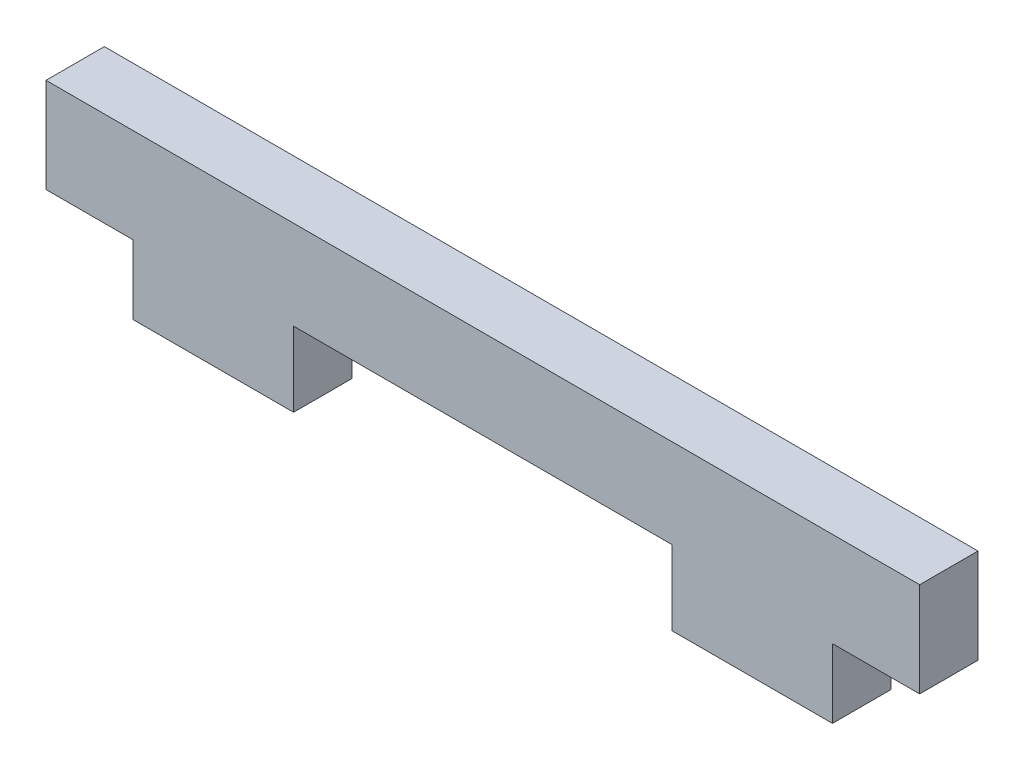
ISO-10303-21;
HEADER;
FILE_DESCRIPTION(('STEP AP214'),'2;1');
FILE_NAME('part.step','',(''),(''),'','','');
FILE_SCHEMA(('AUTOMOTIVE_DESIGN { 1 0 10303 214 1 1 1 1 }'));
ENDSEC;
DATA;
#1=APPLICATION_CONTEXT('core data for automotive mechanical design processes');
#2=APPLICATION_PROTOCOL_DEFINITION('international standard','automotive_design',2000,#1);
#3=PRODUCT_CONTEXT('',#1,'mechanical');
#4=PRODUCT('Part','Part','',(#3));
#5=PRODUCT_RELATED_PRODUCT_CATEGORY('part','',(#4));
#6=PRODUCT_DEFINITION_FORMATION('','',#4);
#7=PRODUCT_DEFINITION_CONTEXT('part definition',#1,'design');
#8=PRODUCT_DEFINITION('design','',#6,#7);
#9=PRODUCT_DEFINITION_SHAPE('','',#8);
#10=(LENGTH_UNIT() NAMED_UNIT(*) SI_UNIT(.MILLI.,.METRE.));
#11=(NAMED_UNIT(*) PLANE_ANGLE_UNIT() SI_UNIT($,.RADIAN.));
#12=(NAMED_UNIT(*) SI_UNIT($,.STERADIAN.) SOLID_ANGLE_UNIT());
#13=UNCERTAINTY_MEASURE_WITH_UNIT(LENGTH_MEASURE(1.E-05),#10,'distance_accuracy_value','');
#14=(GEOMETRIC_REPRESENTATION_CONTEXT(3) GLOBAL_UNCERTAINTY_ASSIGNED_CONTEXT((#13)) GLOBAL_UNIT_ASSIGNED_CONTEXT((#10,
#11,#12)) REPRESENTATION_CONTEXT('',''));
#15=CARTESIAN_POINT('',(0.,0.,0.));
#16=DIRECTION('',(0.,0.,1.));
#17=DIRECTION('',(1.,0.,0.));
#18=AXIS2_PLACEMENT_3D('',#15,#16,#17);
#19=CARTESIAN_POINT('',(-21.693712592762,-6.,3.7));
#20=DIRECTION('',(1.,0.,0.));
#21=DIRECTION('',(0.,1.,0.));
#22=AXIS2_PLACEMENT_3D('',#19,#20,#21);
#23=PLANE('',#22);
#24=DIRECTION('',(0.,-1.,0.));
#25=VECTOR('',#24,1.);
#26=CARTESIAN_POINT('',(-21.693712592762,-6.,0.));
#27=LINE('',#26,#25);
#28=CARTESIAN_POINT('',(-21.693712592762,0.,0.));
#29=VERTEX_POINT('',#28);
#30=CARTESIAN_POINT('',(-21.693712592762,-6.,0.));
#31=VERTEX_POINT('',#30);
#32=EDGE_CURVE('E153',#29,#31,#27,.T.);
#33=ORIENTED_EDGE('',*,*,#32,.T.);
#34=DIRECTION('',(0.,0.,-1.));
#35=VECTOR('',#34,1.);
#36=CARTESIAN_POINT('',(-21.693712592762,-6.,3.7));
#37=LINE('',#36,#35);
#38=CARTESIAN_POINT('',(-21.693712592762,-6.,3.7));
#39=VERTEX_POINT('',#38);
#40=EDGE_CURVE('E11',#39,#31,#37,.T.);
#41=ORIENTED_EDGE('',*,*,#40,.F.);
#42=DIRECTION('',(0.,-1.,0.));
#43=VECTOR('',#42,1.);
#44=CARTESIAN_POINT('',(-21.693712592762,-6.,3.7));
#45=LINE('',#44,#43);
#46=CARTESIAN_POINT('',(-21.693712592762,0.,3.7));
#47=VERTEX_POINT('',#46);
#48=EDGE_CURVE('E175',#47,#39,#45,.T.);
#49=ORIENTED_EDGE('',*,*,#48,.F.);
#50=DIRECTION('',(0.,0.,-1.));
#51=VECTOR('',#50,1.);
#52=CARTESIAN_POINT('',(-21.693712592762,0.,3.7));
#53=LINE('',#52,#51);
#54=EDGE_CURVE('E149',#47,#29,#53,.T.);
#55=ORIENTED_EDGE('',*,*,#54,.T.);
#56=EDGE_LOOP('',(#33,#41,#49,#55));
#57=FACE_BOUND('',#56,.T.);
#58=ADVANCED_FACE('F33',(#57),#23,.F.);
#59=CARTESIAN_POINT('',(-16.163712592762,-6.,3.7));
#60=DIRECTION('',(0.,1.,0.));
#61=DIRECTION('',(0.,0.,1.));
#62=AXIS2_PLACEMENT_3D('',#59,#60,#61);
#63=PLANE('',#62);
#64=DIRECTION('',(1.,0.,0.));
#65=VECTOR('',#64,1.);
#66=CARTESIAN_POINT('',(-16.163712592762,-6.,0.));
#67=LINE('',#66,#65);
#68=CARTESIAN_POINT('',(-16.163712592762,-6.,0.));
#69=VERTEX_POINT('',#68);
#70=EDGE_CURVE('E156',#31,#69,#67,.T.);
#71=ORIENTED_EDGE('',*,*,#70,.T.);
#72=DIRECTION('',(0.,0.,-1.));
#73=VECTOR('',#72,1.);
#74=CARTESIAN_POINT('',(-16.163712592762,-6.,3.7));
#75=LINE('',#74,#73);
#76=CARTESIAN_POINT('',(-16.163712592762,-6.,3.7));
#77=VERTEX_POINT('',#76);
#78=EDGE_CURVE('E41',#77,#69,#75,.T.);
#79=ORIENTED_EDGE('',*,*,#78,.F.);
#80=DIRECTION('',(1.,0.,0.));
#81=VECTOR('',#80,1.);
#82=CARTESIAN_POINT('',(-16.163712592762,-6.,3.7));
#83=LINE('',#82,#81);
#84=EDGE_CURVE('E104',#39,#77,#83,.T.);
#85=ORIENTED_EDGE('',*,*,#84,.F.);
#86=ORIENTED_EDGE('',*,*,#40,.T.);
#87=EDGE_LOOP('',(#71,#79,#85,#86));
#88=FACE_BOUND('',#87,.T.);
#89=ADVANCED_FACE('F253',(#88),#63,.F.);
#90=CARTESIAN_POINT('',(-16.163712592762,-10.3818056675996,3.7));
#91=DIRECTION('',(1.,0.,0.));
#92=DIRECTION('',(0.,0.,-1.));
#93=AXIS2_PLACEMENT_3D('',#90,#91,#92);
#94=PLANE('',#93);
#95=DIRECTION('',(0.,-1.,0.));
#96=VECTOR('',#95,1.);
#97=CARTESIAN_POINT('',(-16.163712592762,-10.3818056675996,0.));
#98=LINE('',#97,#96);
#99=CARTESIAN_POINT('',(-16.163712592762,-10.3818056675996,0.));
#100=VERTEX_POINT('',#99);
#101=EDGE_CURVE('E158',#69,#100,#98,.T.);
#102=ORIENTED_EDGE('',*,*,#101,.T.);
#103=DIRECTION('',(0.,0.,-1.));
#104=VECTOR('',#103,1.);
#105=CARTESIAN_POINT('',(-16.163712592762,-10.3818056675996,3.7));
#106=LINE('',#105,#104);
#107=CARTESIAN_POINT('',(-16.163712592762,-10.3818056675996,3.7));
#108=VERTEX_POINT('',#107);
#109=EDGE_CURVE('E194',#108,#100,#106,.T.);
#110=ORIENTED_EDGE('',*,*,#109,.F.);
#111=DIRECTION('',(0.,-1.,0.));
#112=VECTOR('',#111,1.);
#113=CARTESIAN_POINT('',(-16.163712592762,-10.3818056675996,3.7));
#114=LINE('',#113,#112);
#115=EDGE_CURVE('E202',#77,#108,#114,.T.);
#116=ORIENTED_EDGE('',*,*,#115,.F.);
#117=ORIENTED_EDGE('',*,*,#78,.T.);
#118=EDGE_LOOP('',(#102,#110,#116,#117));
#119=FACE_BOUND('',#118,.T.);
#120=ADVANCED_FACE('F200',(#119),#94,.F.);
#121=CARTESIAN_POINT('',(-5.99371259276197,-10.3818056675996,3.7));
#122=DIRECTION('',(0.,1.,0.));
#123=DIRECTION('',(0.,0.,1.));
#124=AXIS2_PLACEMENT_3D('',#121,#122,#123);
#125=PLANE('',#124);
#126=DIRECTION('',(1.,0.,0.));
#127=VECTOR('',#126,1.);
#128=CARTESIAN_POINT('',(-5.99371259276197,-10.3818056675996,0.));
#129=LINE('',#128,#127);
#130=CARTESIAN_POINT('',(-5.99371259276197,-10.3818056675996,0.));
#131=VERTEX_POINT('',#130);
#132=EDGE_CURVE('E160',#100,#131,#129,.T.);
#133=ORIENTED_EDGE('',*,*,#132,.T.);
#134=DIRECTION('',(0.,0.,-1.));
#135=VECTOR('',#134,1.);
#136=CARTESIAN_POINT('',(-5.99371259276197,-10.3818056675996,3.7));
#137=LINE('',#136,#135);
#138=CARTESIAN_POINT('',(-5.99371259276197,-10.3818056675996,3.7));
#139=VERTEX_POINT('',#138);
#140=EDGE_CURVE('E191',#139,#131,#137,.T.);
#141=ORIENTED_EDGE('',*,*,#140,.F.);
#142=DIRECTION('',(1.,0.,0.));
#143=VECTOR('',#142,1.);
#144=CARTESIAN_POINT('',(-5.99371259276197,-10.3818056675996,3.7));
#145=LINE('',#144,#143);
#146=EDGE_CURVE('E220',#108,#139,#145,.T.);
#147=ORIENTED_EDGE('',*,*,#146,.F.);
#148=ORIENTED_EDGE('',*,*,#109,.T.);
#149=EDGE_LOOP('',(#133,#141,#147,#148));
#150=FACE_BOUND('',#149,.T.);
#151=ADVANCED_FACE('F211',(#150),#125,.F.);
#152=CARTESIAN_POINT('',(-5.99371259276197,-5.65013306973486,3.7));
#153=DIRECTION('',(-1.,0.,0.));
#154=DIRECTION('',(0.,0.,1.));
#155=AXIS2_PLACEMENT_3D('',#152,#153,#154);
#156=PLANE('',#155);
#157=DIRECTION('',(0.,1.,0.));
#158=VECTOR('',#157,1.);
#159=CARTESIAN_POINT('',(-5.99371259276197,-5.65013306973486,0.));
#160=LINE('',#159,#158);
#161=CARTESIAN_POINT('',(-5.99371259276197,-5.65013306973486,0.));
#162=VERTEX_POINT('',#161);
#163=EDGE_CURVE('E162',#131,#162,#160,.T.);
#164=ORIENTED_EDGE('',*,*,#163,.T.);
#165=DIRECTION('',(0.,0.,-1.));
#166=VECTOR('',#165,1.);
#167=CARTESIAN_POINT('',(-5.99371259276197,-5.65013306973486,3.7));
#168=LINE('',#167,#166);
#169=CARTESIAN_POINT('',(-5.99371259276197,-5.65013306973486,3.7));
#170=VERTEX_POINT('',#169);
#171=EDGE_CURVE('E188',#170,#162,#168,.T.);
#172=ORIENTED_EDGE('',*,*,#171,.F.);
#173=DIRECTION('',(0.,1.,0.));
#174=VECTOR('',#173,1.);
#175=CARTESIAN_POINT('',(-5.99371259276197,-5.65013306973486,3.7));
#176=LINE('',#175,#174);
#177=EDGE_CURVE('E217',#139,#170,#176,.T.);
#178=ORIENTED_EDGE('',*,*,#177,.F.);
#179=ORIENTED_EDGE('',*,*,#140,.T.);
#180=EDGE_LOOP('',(#164,#172,#178,#179));
#181=FACE_BOUND('',#180,.T.);
#182=ADVANCED_FACE('F215',(#181),#156,.F.);
#183=CARTESIAN_POINT('',(18.006287407238,-5.65013306973486,3.7));
#184=DIRECTION('',(0.,1.,0.));
#185=DIRECTION('',(0.,0.,1.));
#186=AXIS2_PLACEMENT_3D('',#183,#184,#185);
#187=PLANE('',#186);
#188=DIRECTION('',(1.,0.,0.));
#189=VECTOR('',#188,1.);
#190=CARTESIAN_POINT('',(18.006287407238,-5.65013306973486,0.));
#191=LINE('',#190,#189);
#192=CARTESIAN_POINT('',(18.006287407238,-5.65013306973486,0.));
#193=VERTEX_POINT('',#192);
#194=EDGE_CURVE('E164',#162,#193,#191,.T.);
#195=ORIENTED_EDGE('',*,*,#194,.T.);
#196=DIRECTION('',(0.,0.,-1.));
#197=VECTOR('',#196,1.);
#198=CARTESIAN_POINT('',(18.006287407238,-5.65013306973486,3.7));
#199=LINE('',#198,#197);
#200=CARTESIAN_POINT('',(18.006287407238,-5.65013306973486,3.7));
#201=VERTEX_POINT('',#200);
#202=EDGE_CURVE('E185',#201,#193,#199,.T.);
#203=ORIENTED_EDGE('',*,*,#202,.F.);
#204=DIRECTION('',(1.,0.,0.));
#205=VECTOR('',#204,1.);
#206=CARTESIAN_POINT('',(18.006287407238,-5.65013306973486,3.7));
#207=LINE('',#206,#205);
#208=EDGE_CURVE('E219',#170,#201,#207,.T.);
#209=ORIENTED_EDGE('',*,*,#208,.F.);
#210=ORIENTED_EDGE('',*,*,#171,.T.);
#211=EDGE_LOOP('',(#195,#203,#209,#210));
#212=FACE_BOUND('',#211,.T.);
#213=ADVANCED_FACE('F266',(#212),#187,.F.);
#214=CARTESIAN_POINT('',(18.006287407238,-10.3818056675996,3.7));
#215=DIRECTION('',(1.,0.,0.));
#216=DIRECTION('',(0.,0.,-1.));
#217=AXIS2_PLACEMENT_3D('',#214,#215,#216);
#218=PLANE('',#217);
#219=DIRECTION('',(0.,-1.,0.));
#220=VECTOR('',#219,1.);
#221=CARTESIAN_POINT('',(18.006287407238,-10.3818056675996,0.));
#222=LINE('',#221,#220);
#223=CARTESIAN_POINT('',(18.006287407238,-10.3818056675996,0.));
#224=VERTEX_POINT('',#223);
#225=EDGE_CURVE('E166',#193,#224,#222,.T.);
#226=ORIENTED_EDGE('',*,*,#225,.T.);
#227=DIRECTION('',(0.,0.,-1.));
#228=VECTOR('',#227,1.);
#229=CARTESIAN_POINT('',(18.006287407238,-10.3818056675996,3.7));
#230=LINE('',#229,#228);
#231=CARTESIAN_POINT('',(18.006287407238,-10.3818056675996,3.7));
#232=VERTEX_POINT('',#231);
#233=EDGE_CURVE('E182',#232,#224,#230,.T.);
#234=ORIENTED_EDGE('',*,*,#233,.F.);
#235=DIRECTION('',(0.,-1.,0.));
#236=VECTOR('',#235,1.);
#237=CARTESIAN_POINT('',(18.006287407238,-10.3818056675996,3.7));
#238=LINE('',#237,#236);
#239=EDGE_CURVE('E222',#201,#232,#238,.T.);
#240=ORIENTED_EDGE('',*,*,#239,.F.);
#241=ORIENTED_EDGE('',*,*,#202,.T.);
#242=EDGE_LOOP('',(#226,#234,#240,#241));
#243=FACE_BOUND('',#242,.T.);
#244=ADVANCED_FACE('F269',(#243),#218,.F.);
#245=CARTESIAN_POINT('',(28.176287407238,-10.3818056675996,3.7));
#246=DIRECTION('',(0.,1.,0.));
#247=DIRECTION('',(0.,0.,1.));
#248=AXIS2_PLACEMENT_3D('',#245,#246,#247);
#249=PLANE('',#248);
#250=DIRECTION('',(1.,0.,0.));
#251=VECTOR('',#250,1.);
#252=CARTESIAN_POINT('',(28.176287407238,-10.3818056675996,0.));
#253=LINE('',#252,#251);
#254=CARTESIAN_POINT('',(28.176287407238,-10.3818056675996,0.));
#255=VERTEX_POINT('',#254);
#256=EDGE_CURVE('E168',#224,#255,#253,.T.);
#257=ORIENTED_EDGE('',*,*,#256,.T.);
#258=DIRECTION('',(0.,0.,-1.));
#259=VECTOR('',#258,1.);
#260=CARTESIAN_POINT('',(28.176287407238,-10.3818056675996,3.7));
#261=LINE('',#260,#259);
#262=CARTESIAN_POINT('',(28.176287407238,-10.3818056675996,3.7));
#263=VERTEX_POINT('',#262);
#264=EDGE_CURVE('E179',#263,#255,#261,.T.);
#265=ORIENTED_EDGE('',*,*,#264,.F.);
#266=DIRECTION('',(1.,0.,0.));
#267=VECTOR('',#266,1.);
#268=CARTESIAN_POINT('',(28.176287407238,-10.3818056675996,3.7));
#269=LINE('',#268,#267);
#270=EDGE_CURVE('E228',#232,#263,#269,.T.);
#271=ORIENTED_EDGE('',*,*,#270,.F.);
#272=ORIENTED_EDGE('',*,*,#233,.T.);
#273=EDGE_LOOP('',(#257,#265,#271,#272));
#274=FACE_BOUND('',#273,.T.);
#275=ADVANCED_FACE('F234',(#274),#249,.F.);
#276=CARTESIAN_POINT('',(28.176287407238,-6.,3.7));
#277=DIRECTION('',(-1.,0.,0.));
#278=DIRECTION('',(0.,0.,1.));
#279=AXIS2_PLACEMENT_3D('',#276,#277,#278);
#280=PLANE('',#279);
#281=DIRECTION('',(0.,1.,0.));
#282=VECTOR('',#281,1.);
#283=CARTESIAN_POINT('',(28.176287407238,-6.,0.));
#284=LINE('',#283,#282);
#285=CARTESIAN_POINT('',(28.176287407238,-6.,0.));
#286=VERTEX_POINT('',#285);
#287=EDGE_CURVE('E170',#255,#286,#284,.T.);
#288=ORIENTED_EDGE('',*,*,#287,.T.);
#289=DIRECTION('',(0.,0.,-1.));
#290=VECTOR('',#289,1.);
#291=CARTESIAN_POINT('',(28.176287407238,-6.,3.7));
#292=LINE('',#291,#290);
#293=CARTESIAN_POINT('',(28.176287407238,-6.,3.7));
#294=VERTEX_POINT('',#293);
#295=EDGE_CURVE('E144',#294,#286,#292,.T.);
#296=ORIENTED_EDGE('',*,*,#295,.F.);
#297=DIRECTION('',(0.,1.,0.));
#298=VECTOR('',#297,1.);
#299=CARTESIAN_POINT('',(28.176287407238,-6.,3.7));
#300=LINE('',#299,#298);
#301=EDGE_CURVE('E135',#263,#294,#300,.T.);
#302=ORIENTED_EDGE('',*,*,#301,.F.);
#303=ORIENTED_EDGE('',*,*,#264,.T.);
#304=EDGE_LOOP('',(#288,#296,#302,#303));
#305=FACE_BOUND('',#304,.T.);
#306=ADVANCED_FACE('F238',(#305),#280,.F.);
#307=CARTESIAN_POINT('',(33.706287407238,-6.,3.7));
#308=DIRECTION('',(0.,1.,0.));
#309=DIRECTION('',(0.,0.,1.));
#310=AXIS2_PLACEMENT_3D('',#307,#308,#309);
#311=PLANE('',#310);
#312=DIRECTION('',(1.,0.,0.));
#313=VECTOR('',#312,1.);
#314=CARTESIAN_POINT('',(33.706287407238,-6.,0.));
#315=LINE('',#314,#313);
#316=CARTESIAN_POINT('',(33.706287407238,-6.,0.));
#317=VERTEX_POINT('',#316);
#318=EDGE_CURVE('E143',#286,#317,#315,.T.);
#319=ORIENTED_EDGE('',*,*,#318,.T.);
#320=DIRECTION('',(0.,0.,-1.));
#321=VECTOR('',#320,1.);
#322=CARTESIAN_POINT('',(33.706287407238,-6.,3.7));
#323=LINE('',#322,#321);
#324=CARTESIAN_POINT('',(33.706287407238,-6.,3.7));
#325=VERTEX_POINT('',#324);
#326=EDGE_CURVE('E140',#325,#317,#323,.T.);
#327=ORIENTED_EDGE('',*,*,#326,.F.);
#328=DIRECTION('',(1.,0.,0.));
#329=VECTOR('',#328,1.);
#330=CARTESIAN_POINT('',(33.706287407238,-6.,3.7));
#331=LINE('',#330,#329);
#332=EDGE_CURVE('E129',#294,#325,#331,.T.);
#333=ORIENTED_EDGE('',*,*,#332,.F.);
#334=ORIENTED_EDGE('',*,*,#295,.T.);
#335=EDGE_LOOP('',(#319,#327,#333,#334));
#336=FACE_BOUND('',#335,.T.);
#337=ADVANCED_FACE('F141',(#336),#311,.F.);
#338=CARTESIAN_POINT('',(33.706287407238,0.,3.7));
#339=DIRECTION('',(-1.,0.,0.));
#340=DIRECTION('',(0.,0.,1.));
#341=AXIS2_PLACEMENT_3D('',#338,#339,#340);
#342=PLANE('',#341);
#343=DIRECTION('',(0.,1.,0.));
#344=VECTOR('',#343,1.);
#345=CARTESIAN_POINT('',(33.706287407238,0.,0.));
#346=LINE('',#345,#344);
#347=CARTESIAN_POINT('',(33.706287407238,0.,0.));
#348=VERTEX_POINT('',#347);
#349=EDGE_CURVE('E90',#317,#348,#346,.T.);
#350=ORIENTED_EDGE('',*,*,#349,.T.);
#351=DIRECTION('',(0.,0.,-1.));
#352=VECTOR('',#351,1.);
#353=CARTESIAN_POINT('',(33.706287407238,0.,3.7));
#354=LINE('',#353,#352);
#355=CARTESIAN_POINT('',(33.706287407238,0.,3.7));
#356=VERTEX_POINT('',#355);
#357=EDGE_CURVE('E145',#356,#348,#354,.T.);
#358=ORIENTED_EDGE('',*,*,#357,.F.);
#359=DIRECTION('',(0.,1.,0.));
#360=VECTOR('',#359,1.);
#361=CARTESIAN_POINT('',(33.706287407238,0.,3.7));
#362=LINE('',#361,#360);
#363=EDGE_CURVE('E133',#325,#356,#362,.T.);
#364=ORIENTED_EDGE('',*,*,#363,.F.);
#365=ORIENTED_EDGE('',*,*,#326,.T.);
#366=EDGE_LOOP('',(#350,#358,#364,#365));
#367=FACE_BOUND('',#366,.T.);
#368=ADVANCED_FACE('F147',(#367),#342,.F.);
#369=CARTESIAN_POINT('',(-21.693712592762,0.,3.7));
#370=DIRECTION('',(0.,-1.,0.));
#371=DIRECTION('',(0.,0.,-1.));
#372=AXIS2_PLACEMENT_3D('',#369,#370,#371);
#373=PLANE('',#372);
#374=DIRECTION('',(-1.,0.,0.));
#375=VECTOR('',#374,1.);
#376=CARTESIAN_POINT('',(-21.693712592762,0.,0.));
#377=LINE('',#376,#375);
#378=EDGE_CURVE('E96',#348,#29,#377,.T.);
#379=ORIENTED_EDGE('',*,*,#378,.T.);
#380=ORIENTED_EDGE('',*,*,#54,.F.);
#381=DIRECTION('',(-1.,0.,0.));
#382=VECTOR('',#381,1.);
#383=CARTESIAN_POINT('',(-21.693712592762,0.,3.7));
#384=LINE('',#383,#382);
#385=EDGE_CURVE('E49',#356,#47,#384,.T.);
#386=ORIENTED_EDGE('',*,*,#385,.F.);
#387=ORIENTED_EDGE('',*,*,#357,.T.);
#388=EDGE_LOOP('',(#379,#380,#386,#387));
#389=FACE_BOUND('',#388,.T.);
#390=ADVANCED_FACE('F242',(#389),#373,.F.);
#391=CARTESIAN_POINT('',(0.,0.,3.7));
#392=DIRECTION('',(0.,0.,-1.));
#393=DIRECTION('',(-1.,0.,0.));
#394=AXIS2_PLACEMENT_3D('',#391,#392,#393);
#395=PLANE('',#394);
#396=ORIENTED_EDGE('',*,*,#48,.T.);
#397=ORIENTED_EDGE('',*,*,#84,.T.);
#398=ORIENTED_EDGE('',*,*,#115,.T.);
#399=ORIENTED_EDGE('',*,*,#146,.T.);
#400=ORIENTED_EDGE('',*,*,#177,.T.);
#401=ORIENTED_EDGE('',*,*,#208,.T.);
#402=ORIENTED_EDGE('',*,*,#239,.T.);
#403=ORIENTED_EDGE('',*,*,#270,.T.);
#404=ORIENTED_EDGE('',*,*,#301,.T.);
#405=ORIENTED_EDGE('',*,*,#332,.T.);
#406=ORIENTED_EDGE('',*,*,#363,.T.);
#407=ORIENTED_EDGE('',*,*,#385,.T.);
#408=EDGE_LOOP('',(#396,#397,#398,#399,#400,#401,#402,#403,#404,#405,#406,#407));
#409=FACE_BOUND('',#408,.T.);
#410=ADVANCED_FACE('F131',(#409),#395,.F.);
#411=CARTESIAN_POINT('',(0.,0.,0.));
#412=DIRECTION('',(0.,0.,-1.));
#413=DIRECTION('',(-1.,0.,0.));
#414=AXIS2_PLACEMENT_3D('',#411,#412,#413);
#415=PLANE('',#414);
#416=ORIENTED_EDGE('',*,*,#32,.F.);
#417=ORIENTED_EDGE('',*,*,#378,.F.);
#418=ORIENTED_EDGE('',*,*,#349,.F.);
#419=ORIENTED_EDGE('',*,*,#318,.F.);
#420=ORIENTED_EDGE('',*,*,#287,.F.);
#421=ORIENTED_EDGE('',*,*,#256,.F.);
#422=ORIENTED_EDGE('',*,*,#225,.F.);
#423=ORIENTED_EDGE('',*,*,#194,.F.);
#424=ORIENTED_EDGE('',*,*,#163,.F.);
#425=ORIENTED_EDGE('',*,*,#132,.F.);
#426=ORIENTED_EDGE('',*,*,#101,.F.);
#427=ORIENTED_EDGE('',*,*,#70,.F.);
#428=EDGE_LOOP('',(#416,#417,#418,#419,#420,#421,#422,#423,#424,#425,#426,#427));
#429=FACE_BOUND('',#428,.T.);
#430=ADVANCED_FACE('F206',(#429),#415,.T.);
#431=CLOSED_SHELL('',(#58,#89,#120,#151,#182,#213,#244,#275,#306,#337,#368,#390,#410,#430));
#432=MANIFOLD_SOLID_BREP('B2',#431);
#433=ADVANCED_BREP_SHAPE_REPRESENTATION('',(#18,#432),#14);
#434=SHAPE_DEFINITION_REPRESENTATION(#9,#433);
ENDSEC;
END-ISO-10303-21;
